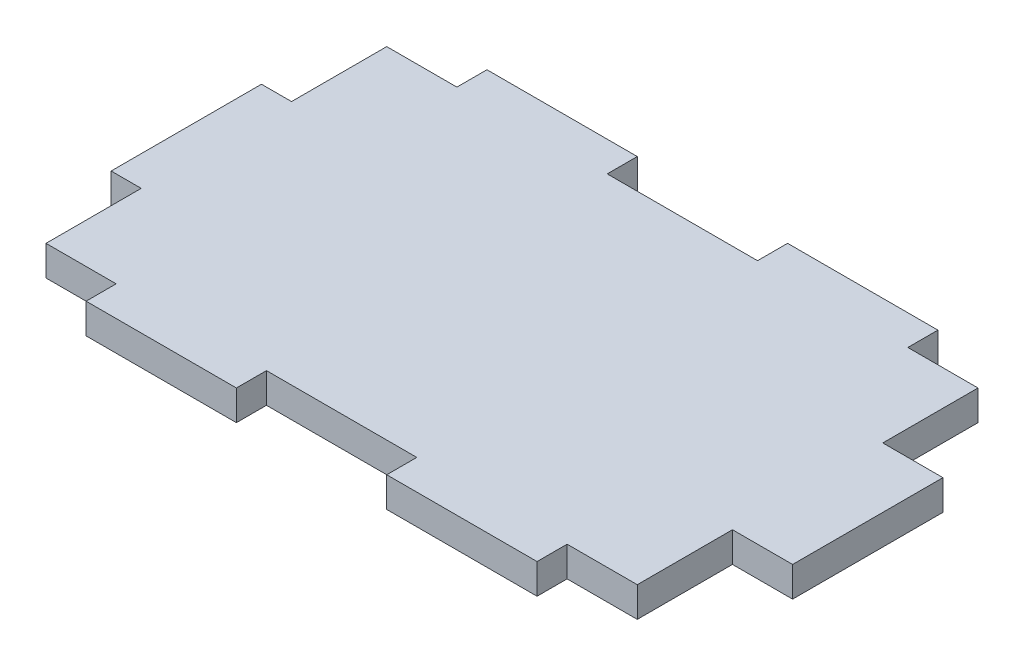
ISO-10303-21;
HEADER;
FILE_DESCRIPTION(('STEP AP214'),'2;1');
FILE_NAME('part.step','',(''),(''),'','','');
FILE_SCHEMA(('AUTOMOTIVE_DESIGN { 1 0 10303 214 1 1 1 1 }'));
ENDSEC;
DATA;
#1=APPLICATION_CONTEXT('core data for automotive mechanical design processes');
#2=APPLICATION_PROTOCOL_DEFINITION('international standard','automotive_design',2000,#1);
#3=PRODUCT_CONTEXT('',#1,'mechanical');
#4=PRODUCT('Part','Part','',(#3));
#5=PRODUCT_RELATED_PRODUCT_CATEGORY('part','',(#4));
#6=PRODUCT_DEFINITION_FORMATION('','',#4);
#7=PRODUCT_DEFINITION_CONTEXT('part definition',#1,'design');
#8=PRODUCT_DEFINITION('design','',#6,#7);
#9=PRODUCT_DEFINITION_SHAPE('','',#8);
#10=(LENGTH_UNIT() NAMED_UNIT(*) SI_UNIT(.MILLI.,.METRE.));
#11=(NAMED_UNIT(*) PLANE_ANGLE_UNIT() SI_UNIT($,.RADIAN.));
#12=(NAMED_UNIT(*) SI_UNIT($,.STERADIAN.) SOLID_ANGLE_UNIT());
#13=UNCERTAINTY_MEASURE_WITH_UNIT(LENGTH_MEASURE(1.E-05),#10,'distance_accuracy_value','');
#14=(GEOMETRIC_REPRESENTATION_CONTEXT(3) GLOBAL_UNCERTAINTY_ASSIGNED_CONTEXT((#13)) GLOBAL_UNIT_ASSIGNED_CONTEXT((#10,
#11,#12)) REPRESENTATION_CONTEXT('',''));
#15=CARTESIAN_POINT('',(0.,0.,0.));
#16=DIRECTION('',(0.,0.,1.));
#17=DIRECTION('',(1.,0.,0.));
#18=AXIS2_PLACEMENT_3D('',#15,#16,#17);
#19=CARTESIAN_POINT('',(55.,3.,0.));
#20=DIRECTION('',(-1.,0.,0.));
#21=DIRECTION('',(0.,0.,1.));
#22=AXIS2_PLACEMENT_3D('',#19,#20,#21);
#23=PLANE('',#22);
#24=DIRECTION('',(0.,0.,-1.));
#25=VECTOR('',#24,1.);
#26=CARTESIAN_POINT('',(55.,0.,0.));
#27=LINE('',#26,#25);
#28=CARTESIAN_POINT('',(55.,0.,0.));
#29=VERTEX_POINT('',#28);
#30=CARTESIAN_POINT('',(55.,0.,-3.));
#31=VERTEX_POINT('',#30);
#32=EDGE_CURVE('E251',#29,#31,#27,.T.);
#33=ORIENTED_EDGE('',*,*,#32,.T.);
#34=DIRECTION('',(0.,-1.,0.));
#35=VECTOR('',#34,1.);
#36=CARTESIAN_POINT('',(55.,3.,-3.));
#37=LINE('',#36,#35);
#38=CARTESIAN_POINT('',(55.,3.,-3.));
#39=VERTEX_POINT('',#38);
#40=EDGE_CURVE('E11',#39,#31,#37,.T.);
#41=ORIENTED_EDGE('',*,*,#40,.F.);
#42=DIRECTION('',(0.,0.,-1.));
#43=VECTOR('',#42,1.);
#44=CARTESIAN_POINT('',(55.,3.,0.));
#45=LINE('',#44,#43);
#46=CARTESIAN_POINT('',(55.,3.,0.));
#47=VERTEX_POINT('',#46);
#48=EDGE_CURVE('E325',#47,#39,#45,.T.);
#49=ORIENTED_EDGE('',*,*,#48,.F.);
#50=DIRECTION('',(0.,-1.,0.));
#51=VECTOR('',#50,1.);
#52=CARTESIAN_POINT('',(55.,3.,0.));
#53=LINE('',#52,#51);
#54=EDGE_CURVE('E250',#47,#29,#53,.T.);
#55=ORIENTED_EDGE('',*,*,#54,.T.);
#56=EDGE_LOOP('',(#33,#41,#49,#55));
#57=FACE_BOUND('',#56,.T.);
#58=ADVANCED_FACE('F34',(#57),#23,.F.);
#59=CARTESIAN_POINT('',(0.,3.,-3.));
#60=DIRECTION('',(0.,0.,-1.));
#61=DIRECTION('',(-1.,0.,0.));
#62=AXIS2_PLACEMENT_3D('',#59,#60,#61);
#63=PLANE('',#62);
#64=DIRECTION('',(1.,0.,0.));
#65=VECTOR('',#64,1.);
#66=CARTESIAN_POINT('',(0.,0.,-3.));
#67=LINE('',#66,#65);
#68=CARTESIAN_POINT('',(62.,0.,-3.));
#69=VERTEX_POINT('',#68);
#70=EDGE_CURVE('E254',#31,#69,#67,.T.);
#71=ORIENTED_EDGE('',*,*,#70,.T.);
#72=DIRECTION('',(0.,-1.,0.));
#73=VECTOR('',#72,1.);
#74=CARTESIAN_POINT('',(62.,3.,-3.));
#75=LINE('',#74,#73);
#76=CARTESIAN_POINT('',(62.,3.,-3.));
#77=VERTEX_POINT('',#76);
#78=EDGE_CURVE('E42',#77,#69,#75,.T.);
#79=ORIENTED_EDGE('',*,*,#78,.F.);
#80=DIRECTION('',(1.,0.,0.));
#81=VECTOR('',#80,1.);
#82=CARTESIAN_POINT('',(0.,3.,-3.));
#83=LINE('',#82,#81);
#84=EDGE_CURVE('E152',#39,#77,#83,.T.);
#85=ORIENTED_EDGE('',*,*,#84,.F.);
#86=ORIENTED_EDGE('',*,*,#40,.T.);
#87=EDGE_LOOP('',(#71,#79,#85,#86));
#88=FACE_BOUND('',#87,.T.);
#89=ADVANCED_FACE('F382',(#88),#63,.F.);
#90=CARTESIAN_POINT('',(62.,3.,0.));
#91=DIRECTION('',(1.,0.,0.));
#92=DIRECTION('',(0.,0.,-1.));
#93=AXIS2_PLACEMENT_3D('',#90,#91,#92);
#94=PLANE('',#93);
#95=DIRECTION('',(0.,0.,1.));
#96=VECTOR('',#95,1.);
#97=CARTESIAN_POINT('',(62.,0.,0.));
#98=LINE('',#97,#96);
#99=CARTESIAN_POINT('',(62.,0.,-12.5));
#100=VERTEX_POINT('',#99);
#101=EDGE_CURVE('E257',#100,#69,#98,.T.);
#102=ORIENTED_EDGE('',*,*,#101,.F.);
#103=DIRECTION('',(0.,-1.,0.));
#104=VECTOR('',#103,1.);
#105=CARTESIAN_POINT('',(62.,3.,-12.5));
#106=LINE('',#105,#104);
#107=CARTESIAN_POINT('',(62.,3.,-12.5));
#108=VERTEX_POINT('',#107);
#109=EDGE_CURVE('E375',#108,#100,#106,.T.);
#110=ORIENTED_EDGE('',*,*,#109,.F.);
#111=DIRECTION('',(0.,0.,1.));
#112=VECTOR('',#111,1.);
#113=CARTESIAN_POINT('',(62.,3.,0.));
#114=LINE('',#113,#112);
#115=EDGE_CURVE('E381',#108,#77,#114,.T.);
#116=ORIENTED_EDGE('',*,*,#115,.T.);
#117=ORIENTED_EDGE('',*,*,#78,.T.);
#118=EDGE_LOOP('',(#102,#110,#116,#117));
#119=FACE_BOUND('',#118,.T.);
#120=ADVANCED_FACE('F379',(#119),#94,.T.);
#121=CARTESIAN_POINT('',(0.,3.,-12.5));
#122=DIRECTION('',(0.,0.,1.));
#123=DIRECTION('',(1.,0.,0.));
#124=AXIS2_PLACEMENT_3D('',#121,#122,#123);
#125=PLANE('',#124);
#126=DIRECTION('',(-1.,0.,0.));
#127=VECTOR('',#126,1.);
#128=CARTESIAN_POINT('',(0.,0.,-12.5));
#129=LINE('',#128,#127);
#130=CARTESIAN_POINT('',(68.,0.,-12.5));
#131=VERTEX_POINT('',#130);
#132=EDGE_CURVE('E260',#131,#100,#129,.T.);
#133=ORIENTED_EDGE('',*,*,#132,.F.);
#134=DIRECTION('',(0.,-1.,0.));
#135=VECTOR('',#134,1.);
#136=CARTESIAN_POINT('',(68.,3.,-12.5));
#137=LINE('',#136,#135);
#138=CARTESIAN_POINT('',(68.,3.,-12.5));
#139=VERTEX_POINT('',#138);
#140=EDGE_CURVE('E373',#139,#131,#137,.T.);
#141=ORIENTED_EDGE('',*,*,#140,.F.);
#142=DIRECTION('',(-1.,0.,0.));
#143=VECTOR('',#142,1.);
#144=CARTESIAN_POINT('',(0.,3.,-12.5));
#145=LINE('',#144,#143);
#146=EDGE_CURVE('E394',#139,#108,#145,.T.);
#147=ORIENTED_EDGE('',*,*,#146,.T.);
#148=ORIENTED_EDGE('',*,*,#109,.T.);
#149=EDGE_LOOP('',(#133,#141,#147,#148));
#150=FACE_BOUND('',#149,.T.);
#151=ADVANCED_FACE('F391',(#150),#125,.T.);
#152=CARTESIAN_POINT('',(68.,3.,0.));
#153=DIRECTION('',(1.,0.,0.));
#154=DIRECTION('',(0.,0.,-1.));
#155=AXIS2_PLACEMENT_3D('',#152,#153,#154);
#156=PLANE('',#155);
#157=DIRECTION('',(0.,0.,1.));
#158=VECTOR('',#157,1.);
#159=CARTESIAN_POINT('',(68.,0.,0.));
#160=LINE('',#159,#158);
#161=CARTESIAN_POINT('',(68.,0.,-27.5));
#162=VERTEX_POINT('',#161);
#163=EDGE_CURVE('E263',#162,#131,#160,.T.);
#164=ORIENTED_EDGE('',*,*,#163,.F.);
#165=DIRECTION('',(0.,-1.,0.));
#166=VECTOR('',#165,1.);
#167=CARTESIAN_POINT('',(68.,3.,-27.5));
#168=LINE('',#167,#166);
#169=CARTESIAN_POINT('',(68.,3.,-27.5));
#170=VERTEX_POINT('',#169);
#171=EDGE_CURVE('E371',#170,#162,#168,.T.);
#172=ORIENTED_EDGE('',*,*,#171,.F.);
#173=DIRECTION('',(0.,0.,1.));
#174=VECTOR('',#173,1.);
#175=CARTESIAN_POINT('',(68.,3.,0.));
#176=LINE('',#175,#174);
#177=EDGE_CURVE('E398',#170,#139,#176,.T.);
#178=ORIENTED_EDGE('',*,*,#177,.T.);
#179=ORIENTED_EDGE('',*,*,#140,.T.);
#180=EDGE_LOOP('',(#164,#172,#178,#179));
#181=FACE_BOUND('',#180,.T.);
#182=ADVANCED_FACE('F482',(#181),#156,.T.);
#183=CARTESIAN_POINT('',(0.,3.,-27.5));
#184=DIRECTION('',(0.,0.,1.));
#185=DIRECTION('',(1.,0.,0.));
#186=AXIS2_PLACEMENT_3D('',#183,#184,#185);
#187=PLANE('',#186);
#188=DIRECTION('',(-1.,0.,0.));
#189=VECTOR('',#188,1.);
#190=CARTESIAN_POINT('',(0.,0.,-27.5));
#191=LINE('',#190,#189);
#192=CARTESIAN_POINT('',(62.,0.,-27.5));
#193=VERTEX_POINT('',#192);
#194=EDGE_CURVE('E266',#162,#193,#191,.T.);
#195=ORIENTED_EDGE('',*,*,#194,.T.);
#196=DIRECTION('',(0.,-1.,0.));
#197=VECTOR('',#196,1.);
#198=CARTESIAN_POINT('',(62.,3.,-27.5));
#199=LINE('',#198,#197);
#200=CARTESIAN_POINT('',(62.,3.,-27.5));
#201=VERTEX_POINT('',#200);
#202=EDGE_CURVE('E368',#201,#193,#199,.T.);
#203=ORIENTED_EDGE('',*,*,#202,.F.);
#204=DIRECTION('',(-1.,0.,0.));
#205=VECTOR('',#204,1.);
#206=CARTESIAN_POINT('',(0.,3.,-27.5));
#207=LINE('',#206,#205);
#208=EDGE_CURVE('E404',#170,#201,#207,.T.);
#209=ORIENTED_EDGE('',*,*,#208,.F.);
#210=ORIENTED_EDGE('',*,*,#171,.T.);
#211=EDGE_LOOP('',(#195,#203,#209,#210));
#212=FACE_BOUND('',#211,.T.);
#213=ADVANCED_FACE('F485',(#212),#187,.F.);
#214=CARTESIAN_POINT('',(62.,3.,0.));
#215=DIRECTION('',(-1.,0.,0.));
#216=DIRECTION('',(0.,0.,1.));
#217=AXIS2_PLACEMENT_3D('',#214,#215,#216);
#218=PLANE('',#217);
#219=DIRECTION('',(0.,0.,-1.));
#220=VECTOR('',#219,1.);
#221=CARTESIAN_POINT('',(62.,0.,0.));
#222=LINE('',#221,#220);
#223=CARTESIAN_POINT('',(62.,0.,-37.));
#224=VERTEX_POINT('',#223);
#225=EDGE_CURVE('E268',#193,#224,#222,.T.);
#226=ORIENTED_EDGE('',*,*,#225,.T.);
#227=DIRECTION('',(0.,-1.,0.));
#228=VECTOR('',#227,1.);
#229=CARTESIAN_POINT('',(62.,3.,-37.));
#230=LINE('',#229,#228);
#231=CARTESIAN_POINT('',(62.,3.,-37.));
#232=VERTEX_POINT('',#231);
#233=EDGE_CURVE('E366',#232,#224,#230,.T.);
#234=ORIENTED_EDGE('',*,*,#233,.F.);
#235=DIRECTION('',(0.,0.,-1.));
#236=VECTOR('',#235,1.);
#237=CARTESIAN_POINT('',(62.,3.,0.));
#238=LINE('',#237,#236);
#239=EDGE_CURVE('E406',#201,#232,#238,.T.);
#240=ORIENTED_EDGE('',*,*,#239,.F.);
#241=ORIENTED_EDGE('',*,*,#202,.T.);
#242=EDGE_LOOP('',(#226,#234,#240,#241));
#243=FACE_BOUND('',#242,.T.);
#244=ADVANCED_FACE('F489',(#243),#218,.F.);
#245=CARTESIAN_POINT('',(0.,3.,-37.));
#246=DIRECTION('',(0.,0.,-1.));
#247=DIRECTION('',(-1.,0.,0.));
#248=AXIS2_PLACEMENT_3D('',#245,#246,#247);
#249=PLANE('',#248);
#250=DIRECTION('',(1.,0.,0.));
#251=VECTOR('',#250,1.);
#252=CARTESIAN_POINT('',(0.,0.,-37.));
#253=LINE('',#252,#251);
#254=CARTESIAN_POINT('',(55.,0.,-37.));
#255=VERTEX_POINT('',#254);
#256=EDGE_CURVE('E271',#255,#224,#253,.T.);
#257=ORIENTED_EDGE('',*,*,#256,.F.);
#258=DIRECTION('',(0.,-1.,0.));
#259=VECTOR('',#258,1.);
#260=CARTESIAN_POINT('',(55.,3.,-37.));
#261=LINE('',#260,#259);
#262=CARTESIAN_POINT('',(55.,3.,-37.));
#263=VERTEX_POINT('',#262);
#264=EDGE_CURVE('E364',#263,#255,#261,.T.);
#265=ORIENTED_EDGE('',*,*,#264,.F.);
#266=DIRECTION('',(1.,0.,0.));
#267=VECTOR('',#266,1.);
#268=CARTESIAN_POINT('',(0.,3.,-37.));
#269=LINE('',#268,#267);
#270=EDGE_CURVE('E408',#263,#232,#269,.T.);
#271=ORIENTED_EDGE('',*,*,#270,.T.);
#272=ORIENTED_EDGE('',*,*,#233,.T.);
#273=EDGE_LOOP('',(#257,#265,#271,#272));
#274=FACE_BOUND('',#273,.T.);
#275=ADVANCED_FACE('F493',(#274),#249,.T.);
#276=CARTESIAN_POINT('',(55.,3.,0.));
#277=DIRECTION('',(1.,0.,0.));
#278=DIRECTION('',(0.,0.,-1.));
#279=AXIS2_PLACEMENT_3D('',#276,#277,#278);
#280=PLANE('',#279);
#281=DIRECTION('',(0.,0.,1.));
#282=VECTOR('',#281,1.);
#283=CARTESIAN_POINT('',(55.,0.,0.));
#284=LINE('',#283,#282);
#285=CARTESIAN_POINT('',(55.,0.,-40.));
#286=VERTEX_POINT('',#285);
#287=EDGE_CURVE('E274',#286,#255,#284,.T.);
#288=ORIENTED_EDGE('',*,*,#287,.F.);
#289=DIRECTION('',(0.,-1.,0.));
#290=VECTOR('',#289,1.);
#291=CARTESIAN_POINT('',(55.,3.,-40.));
#292=LINE('',#291,#290);
#293=CARTESIAN_POINT('',(55.,3.,-40.));
#294=VERTEX_POINT('',#293);
#295=EDGE_CURVE('E362',#294,#286,#292,.T.);
#296=ORIENTED_EDGE('',*,*,#295,.F.);
#297=DIRECTION('',(0.,0.,1.));
#298=VECTOR('',#297,1.);
#299=CARTESIAN_POINT('',(55.,3.,0.));
#300=LINE('',#299,#298);
#301=EDGE_CURVE('E411',#294,#263,#300,.T.);
#302=ORIENTED_EDGE('',*,*,#301,.T.);
#303=ORIENTED_EDGE('',*,*,#264,.T.);
#304=EDGE_LOOP('',(#288,#296,#302,#303));
#305=FACE_BOUND('',#304,.T.);
#306=ADVANCED_FACE('F497',(#305),#280,.T.);
#307=CARTESIAN_POINT('',(0.,3.,-40.));
#308=DIRECTION('',(0.,0.,-1.));
#309=DIRECTION('',(-1.,0.,0.));
#310=AXIS2_PLACEMENT_3D('',#307,#308,#309);
#311=PLANE('',#310);
#312=DIRECTION('',(1.,0.,0.));
#313=VECTOR('',#312,1.);
#314=CARTESIAN_POINT('',(0.,0.,-40.));
#315=LINE('',#314,#313);
#316=CARTESIAN_POINT('',(40.,0.,-40.));
#317=VERTEX_POINT('',#316);
#318=EDGE_CURVE('E277',#317,#286,#315,.T.);
#319=ORIENTED_EDGE('',*,*,#318,.F.);
#320=DIRECTION('',(0.,-1.,0.));
#321=VECTOR('',#320,1.);
#322=CARTESIAN_POINT('',(40.,3.,-40.));
#323=LINE('',#322,#321);
#324=CARTESIAN_POINT('',(40.,3.,-40.));
#325=VERTEX_POINT('',#324);
#326=EDGE_CURVE('E360',#325,#317,#323,.T.);
#327=ORIENTED_EDGE('',*,*,#326,.F.);
#328=DIRECTION('',(1.,0.,0.));
#329=VECTOR('',#328,1.);
#330=CARTESIAN_POINT('',(0.,3.,-40.));
#331=LINE('',#330,#329);
#332=EDGE_CURVE('E414',#325,#294,#331,.T.);
#333=ORIENTED_EDGE('',*,*,#332,.T.);
#334=ORIENTED_EDGE('',*,*,#295,.T.);
#335=EDGE_LOOP('',(#319,#327,#333,#334));
#336=FACE_BOUND('',#335,.T.);
#337=ADVANCED_FACE('F501',(#336),#311,.T.);
#338=CARTESIAN_POINT('',(40.,3.,0.));
#339=DIRECTION('',(-1.,0.,0.));
#340=DIRECTION('',(0.,0.,1.));
#341=AXIS2_PLACEMENT_3D('',#338,#339,#340);
#342=PLANE('',#341);
#343=DIRECTION('',(0.,0.,-1.));
#344=VECTOR('',#343,1.);
#345=CARTESIAN_POINT('',(40.,0.,0.));
#346=LINE('',#345,#344);
#347=CARTESIAN_POINT('',(40.,0.,-37.));
#348=VERTEX_POINT('',#347);
#349=EDGE_CURVE('E280',#348,#317,#346,.T.);
#350=ORIENTED_EDGE('',*,*,#349,.F.);
#351=DIRECTION('',(0.,-1.,0.));
#352=VECTOR('',#351,1.);
#353=CARTESIAN_POINT('',(40.,3.,-37.));
#354=LINE('',#353,#352);
#355=CARTESIAN_POINT('',(40.,3.,-37.));
#356=VERTEX_POINT('',#355);
#357=EDGE_CURVE('E358',#356,#348,#354,.T.);
#358=ORIENTED_EDGE('',*,*,#357,.F.);
#359=DIRECTION('',(0.,0.,-1.));
#360=VECTOR('',#359,1.);
#361=CARTESIAN_POINT('',(40.,3.,0.));
#362=LINE('',#361,#360);
#363=EDGE_CURVE('E417',#356,#325,#362,.T.);
#364=ORIENTED_EDGE('',*,*,#363,.T.);
#365=ORIENTED_EDGE('',*,*,#326,.T.);
#366=EDGE_LOOP('',(#350,#358,#364,#365));
#367=FACE_BOUND('',#366,.T.);
#368=ADVANCED_FACE('F505',(#367),#342,.T.);
#369=CARTESIAN_POINT('',(0.,3.,-37.));
#370=DIRECTION('',(0.,0.,1.));
#371=DIRECTION('',(1.,0.,0.));
#372=AXIS2_PLACEMENT_3D('',#369,#370,#371);
#373=PLANE('',#372);
#374=DIRECTION('',(-1.,0.,0.));
#375=VECTOR('',#374,1.);
#376=CARTESIAN_POINT('',(0.,0.,-37.));
#377=LINE('',#376,#375);
#378=CARTESIAN_POINT('',(25.,0.,-37.));
#379=VERTEX_POINT('',#378);
#380=EDGE_CURVE('E283',#348,#379,#377,.T.);
#381=ORIENTED_EDGE('',*,*,#380,.T.);
#382=DIRECTION('',(0.,-1.,0.));
#383=VECTOR('',#382,1.);
#384=CARTESIAN_POINT('',(25.,3.,-37.));
#385=LINE('',#384,#383);
#386=CARTESIAN_POINT('',(25.,3.,-37.));
#387=VERTEX_POINT('',#386);
#388=EDGE_CURVE('E355',#387,#379,#385,.T.);
#389=ORIENTED_EDGE('',*,*,#388,.F.);
#390=DIRECTION('',(-1.,0.,0.));
#391=VECTOR('',#390,1.);
#392=CARTESIAN_POINT('',(0.,3.,-37.));
#393=LINE('',#392,#391);
#394=EDGE_CURVE('E420',#356,#387,#393,.T.);
#395=ORIENTED_EDGE('',*,*,#394,.F.);
#396=ORIENTED_EDGE('',*,*,#357,.T.);
#397=EDGE_LOOP('',(#381,#389,#395,#396));
#398=FACE_BOUND('',#397,.T.);
#399=ADVANCED_FACE('F509',(#398),#373,.F.);
#400=CARTESIAN_POINT('',(25.,3.,0.));
#401=DIRECTION('',(-1.,0.,0.));
#402=DIRECTION('',(0.,0.,1.));
#403=AXIS2_PLACEMENT_3D('',#400,#401,#402);
#404=PLANE('',#403);
#405=DIRECTION('',(0.,0.,-1.));
#406=VECTOR('',#405,1.);
#407=CARTESIAN_POINT('',(25.,0.,0.));
#408=LINE('',#407,#406);
#409=CARTESIAN_POINT('',(25.,0.,-40.));
#410=VERTEX_POINT('',#409);
#411=EDGE_CURVE('E285',#379,#410,#408,.T.);
#412=ORIENTED_EDGE('',*,*,#411,.T.);
#413=DIRECTION('',(0.,-1.,0.));
#414=VECTOR('',#413,1.);
#415=CARTESIAN_POINT('',(25.,3.,-40.));
#416=LINE('',#415,#414);
#417=CARTESIAN_POINT('',(25.,3.,-40.));
#418=VERTEX_POINT('',#417);
#419=EDGE_CURVE('E353',#418,#410,#416,.T.);
#420=ORIENTED_EDGE('',*,*,#419,.F.);
#421=DIRECTION('',(0.,0.,-1.));
#422=VECTOR('',#421,1.);
#423=CARTESIAN_POINT('',(25.,3.,0.));
#424=LINE('',#423,#422);
#425=EDGE_CURVE('E422',#387,#418,#424,.T.);
#426=ORIENTED_EDGE('',*,*,#425,.F.);
#427=ORIENTED_EDGE('',*,*,#388,.T.);
#428=EDGE_LOOP('',(#412,#420,#426,#427));
#429=FACE_BOUND('',#428,.T.);
#430=ADVANCED_FACE('F513',(#429),#404,.F.);
#431=CARTESIAN_POINT('',(0.,3.,-40.));
#432=DIRECTION('',(0.,0.,-1.));
#433=DIRECTION('',(-1.,0.,0.));
#434=AXIS2_PLACEMENT_3D('',#431,#432,#433);
#435=PLANE('',#434);
#436=DIRECTION('',(1.,0.,0.));
#437=VECTOR('',#436,1.);
#438=CARTESIAN_POINT('',(0.,0.,-40.));
#439=LINE('',#438,#437);
#440=CARTESIAN_POINT('',(10.,0.,-40.));
#441=VERTEX_POINT('',#440);
#442=EDGE_CURVE('E288',#441,#410,#439,.T.);
#443=ORIENTED_EDGE('',*,*,#442,.F.);
#444=DIRECTION('',(0.,-1.,0.));
#445=VECTOR('',#444,1.);
#446=CARTESIAN_POINT('',(10.,3.,-40.));
#447=LINE('',#446,#445);
#448=CARTESIAN_POINT('',(10.,3.,-40.));
#449=VERTEX_POINT('',#448);
#450=EDGE_CURVE('E351',#449,#441,#447,.T.);
#451=ORIENTED_EDGE('',*,*,#450,.F.);
#452=DIRECTION('',(1.,0.,0.));
#453=VECTOR('',#452,1.);
#454=CARTESIAN_POINT('',(0.,3.,-40.));
#455=LINE('',#454,#453);
#456=EDGE_CURVE('E424',#449,#418,#455,.T.);
#457=ORIENTED_EDGE('',*,*,#456,.T.);
#458=ORIENTED_EDGE('',*,*,#419,.T.);
#459=EDGE_LOOP('',(#443,#451,#457,#458));
#460=FACE_BOUND('',#459,.T.);
#461=ADVANCED_FACE('F517',(#460),#435,.T.);
#462=CARTESIAN_POINT('',(10.,3.,0.));
#463=DIRECTION('',(1.,0.,0.));
#464=DIRECTION('',(0.,0.,-1.));
#465=AXIS2_PLACEMENT_3D('',#462,#463,#464);
#466=PLANE('',#465);
#467=DIRECTION('',(0.,0.,1.));
#468=VECTOR('',#467,1.);
#469=CARTESIAN_POINT('',(10.,0.,0.));
#470=LINE('',#469,#468);
#471=CARTESIAN_POINT('',(10.,0.,-37.));
#472=VERTEX_POINT('',#471);
#473=EDGE_CURVE('E291',#441,#472,#470,.T.);
#474=ORIENTED_EDGE('',*,*,#473,.T.);
#475=DIRECTION('',(0.,-1.,0.));
#476=VECTOR('',#475,1.);
#477=CARTESIAN_POINT('',(10.,3.,-37.));
#478=LINE('',#477,#476);
#479=CARTESIAN_POINT('',(10.,3.,-37.));
#480=VERTEX_POINT('',#479);
#481=EDGE_CURVE('E348',#480,#472,#478,.T.);
#482=ORIENTED_EDGE('',*,*,#481,.F.);
#483=DIRECTION('',(0.,0.,1.));
#484=VECTOR('',#483,1.);
#485=CARTESIAN_POINT('',(10.,3.,0.));
#486=LINE('',#485,#484);
#487=EDGE_CURVE('E427',#449,#480,#486,.T.);
#488=ORIENTED_EDGE('',*,*,#487,.F.);
#489=ORIENTED_EDGE('',*,*,#450,.T.);
#490=EDGE_LOOP('',(#474,#482,#488,#489));
#491=FACE_BOUND('',#490,.T.);
#492=ADVANCED_FACE('F521',(#491),#466,.F.);
#493=CARTESIAN_POINT('',(0.,3.,-37.));
#494=DIRECTION('',(0.,0.,1.));
#495=DIRECTION('',(1.,0.,0.));
#496=AXIS2_PLACEMENT_3D('',#493,#494,#495);
#497=PLANE('',#496);
#498=DIRECTION('',(-1.,0.,0.));
#499=VECTOR('',#498,1.);
#500=CARTESIAN_POINT('',(0.,0.,-37.));
#501=LINE('',#500,#499);
#502=CARTESIAN_POINT('',(3.,0.,-37.));
#503=VERTEX_POINT('',#502);
#504=EDGE_CURVE('E293',#472,#503,#501,.T.);
#505=ORIENTED_EDGE('',*,*,#504,.T.);
#506=DIRECTION('',(0.,-1.,0.));
#507=VECTOR('',#506,1.);
#508=CARTESIAN_POINT('',(3.,3.,-37.));
#509=LINE('',#508,#507);
#510=CARTESIAN_POINT('',(3.,3.,-37.));
#511=VERTEX_POINT('',#510);
#512=EDGE_CURVE('E346',#511,#503,#509,.T.);
#513=ORIENTED_EDGE('',*,*,#512,.F.);
#514=DIRECTION('',(-1.,0.,0.));
#515=VECTOR('',#514,1.);
#516=CARTESIAN_POINT('',(0.,3.,-37.));
#517=LINE('',#516,#515);
#518=EDGE_CURVE('E429',#480,#511,#517,.T.);
#519=ORIENTED_EDGE('',*,*,#518,.F.);
#520=ORIENTED_EDGE('',*,*,#481,.T.);
#521=EDGE_LOOP('',(#505,#513,#519,#520));
#522=FACE_BOUND('',#521,.T.);
#523=ADVANCED_FACE('F525',(#522),#497,.F.);
#524=CARTESIAN_POINT('',(3.,3.,0.));
#525=DIRECTION('',(-1.,0.,0.));
#526=DIRECTION('',(0.,0.,1.));
#527=AXIS2_PLACEMENT_3D('',#524,#525,#526);
#528=PLANE('',#527);
#529=DIRECTION('',(0.,0.,-1.));
#530=VECTOR('',#529,1.);
#531=CARTESIAN_POINT('',(3.,0.,0.));
#532=LINE('',#531,#530);
#533=CARTESIAN_POINT('',(3.,0.,-27.5));
#534=VERTEX_POINT('',#533);
#535=EDGE_CURVE('E296',#534,#503,#532,.T.);
#536=ORIENTED_EDGE('',*,*,#535,.F.);
#537=DIRECTION('',(0.,-1.,0.));
#538=VECTOR('',#537,1.);
#539=CARTESIAN_POINT('',(3.,3.,-27.5));
#540=LINE('',#539,#538);
#541=CARTESIAN_POINT('',(3.,3.,-27.5));
#542=VERTEX_POINT('',#541);
#543=EDGE_CURVE('E344',#542,#534,#540,.T.);
#544=ORIENTED_EDGE('',*,*,#543,.F.);
#545=DIRECTION('',(0.,0.,-1.));
#546=VECTOR('',#545,1.);
#547=CARTESIAN_POINT('',(3.,3.,0.));
#548=LINE('',#547,#546);
#549=EDGE_CURVE('E431',#542,#511,#548,.T.);
#550=ORIENTED_EDGE('',*,*,#549,.T.);
#551=ORIENTED_EDGE('',*,*,#512,.T.);
#552=EDGE_LOOP('',(#536,#544,#550,#551));
#553=FACE_BOUND('',#552,.T.);
#554=ADVANCED_FACE('F529',(#553),#528,.T.);
#555=CARTESIAN_POINT('',(0.,3.,-27.5));
#556=DIRECTION('',(0.,0.,-1.));
#557=DIRECTION('',(-1.,0.,0.));
#558=AXIS2_PLACEMENT_3D('',#555,#556,#557);
#559=PLANE('',#558);
#560=DIRECTION('',(1.,0.,0.));
#561=VECTOR('',#560,1.);
#562=CARTESIAN_POINT('',(0.,0.,-27.5));
#563=LINE('',#562,#561);
#564=CARTESIAN_POINT('',(0.,0.,-27.5));
#565=VERTEX_POINT('',#564);
#566=EDGE_CURVE('E299',#565,#534,#563,.T.);
#567=ORIENTED_EDGE('',*,*,#566,.F.);
#568=DIRECTION('',(0.,-1.,0.));
#569=VECTOR('',#568,1.);
#570=CARTESIAN_POINT('',(0.,3.,-27.5));
#571=LINE('',#570,#569);
#572=CARTESIAN_POINT('',(0.,3.,-27.5));
#573=VERTEX_POINT('',#572);
#574=EDGE_CURVE('E342',#573,#565,#571,.T.);
#575=ORIENTED_EDGE('',*,*,#574,.F.);
#576=DIRECTION('',(1.,0.,0.));
#577=VECTOR('',#576,1.);
#578=CARTESIAN_POINT('',(0.,3.,-27.5));
#579=LINE('',#578,#577);
#580=EDGE_CURVE('E434',#573,#542,#579,.T.);
#581=ORIENTED_EDGE('',*,*,#580,.T.);
#582=ORIENTED_EDGE('',*,*,#543,.T.);
#583=EDGE_LOOP('',(#567,#575,#581,#582));
#584=FACE_BOUND('',#583,.T.);
#585=ADVANCED_FACE('F533',(#584),#559,.T.);
#586=CARTESIAN_POINT('',(0.,3.,0.));
#587=DIRECTION('',(-1.,0.,0.));
#588=DIRECTION('',(0.,0.,1.));
#589=AXIS2_PLACEMENT_3D('',#586,#587,#588);
#590=PLANE('',#589);
#591=DIRECTION('',(0.,0.,-1.));
#592=VECTOR('',#591,1.);
#593=CARTESIAN_POINT('',(0.,0.,0.));
#594=LINE('',#593,#592);
#595=CARTESIAN_POINT('',(0.,0.,-12.5));
#596=VERTEX_POINT('',#595);
#597=EDGE_CURVE('E302',#596,#565,#594,.T.);
#598=ORIENTED_EDGE('',*,*,#597,.F.);
#599=DIRECTION('',(0.,-1.,0.));
#600=VECTOR('',#599,1.);
#601=CARTESIAN_POINT('',(0.,3.,-12.5));
#602=LINE('',#601,#600);
#603=CARTESIAN_POINT('',(0.,3.,-12.5));
#604=VERTEX_POINT('',#603);
#605=EDGE_CURVE('E340',#604,#596,#602,.T.);
#606=ORIENTED_EDGE('',*,*,#605,.F.);
#607=DIRECTION('',(0.,0.,-1.));
#608=VECTOR('',#607,1.);
#609=CARTESIAN_POINT('',(0.,3.,0.));
#610=LINE('',#609,#608);
#611=EDGE_CURVE('E437',#604,#573,#610,.T.);
#612=ORIENTED_EDGE('',*,*,#611,.T.);
#613=ORIENTED_EDGE('',*,*,#574,.T.);
#614=EDGE_LOOP('',(#598,#606,#612,#613));
#615=FACE_BOUND('',#614,.T.);
#616=ADVANCED_FACE('F537',(#615),#590,.T.);
#617=CARTESIAN_POINT('',(0.,3.,-12.5));
#618=DIRECTION('',(0.,0.,-1.));
#619=DIRECTION('',(-1.,0.,0.));
#620=AXIS2_PLACEMENT_3D('',#617,#618,#619);
#621=PLANE('',#620);
#622=DIRECTION('',(1.,0.,0.));
#623=VECTOR('',#622,1.);
#624=CARTESIAN_POINT('',(0.,0.,-12.5));
#625=LINE('',#624,#623);
#626=CARTESIAN_POINT('',(3.,0.,-12.5));
#627=VERTEX_POINT('',#626);
#628=EDGE_CURVE('E305',#596,#627,#625,.T.);
#629=ORIENTED_EDGE('',*,*,#628,.T.);
#630=DIRECTION('',(0.,-1.,0.));
#631=VECTOR('',#630,1.);
#632=CARTESIAN_POINT('',(3.,3.,-12.5));
#633=LINE('',#632,#631);
#634=CARTESIAN_POINT('',(3.,3.,-12.5));
#635=VERTEX_POINT('',#634);
#636=EDGE_CURVE('E337',#635,#627,#633,.T.);
#637=ORIENTED_EDGE('',*,*,#636,.F.);
#638=DIRECTION('',(1.,0.,0.));
#639=VECTOR('',#638,1.);
#640=CARTESIAN_POINT('',(0.,3.,-12.5));
#641=LINE('',#640,#639);
#642=EDGE_CURVE('E440',#604,#635,#641,.T.);
#643=ORIENTED_EDGE('',*,*,#642,.F.);
#644=ORIENTED_EDGE('',*,*,#605,.T.);
#645=EDGE_LOOP('',(#629,#637,#643,#644));
#646=FACE_BOUND('',#645,.T.);
#647=ADVANCED_FACE('F541',(#646),#621,.F.);
#648=CARTESIAN_POINT('',(3.,3.,0.));
#649=DIRECTION('',(1.,0.,0.));
#650=DIRECTION('',(0.,0.,-1.));
#651=AXIS2_PLACEMENT_3D('',#648,#649,#650);
#652=PLANE('',#651);
#653=DIRECTION('',(0.,0.,1.));
#654=VECTOR('',#653,1.);
#655=CARTESIAN_POINT('',(3.,0.,0.));
#656=LINE('',#655,#654);
#657=CARTESIAN_POINT('',(3.,0.,-3.));
#658=VERTEX_POINT('',#657);
#659=EDGE_CURVE('E307',#627,#658,#656,.T.);
#660=ORIENTED_EDGE('',*,*,#659,.T.);
#661=DIRECTION('',(0.,-1.,0.));
#662=VECTOR('',#661,1.);
#663=CARTESIAN_POINT('',(3.,3.,-3.));
#664=LINE('',#663,#662);
#665=CARTESIAN_POINT('',(3.,3.,-3.));
#666=VERTEX_POINT('',#665);
#667=EDGE_CURVE('E335',#666,#658,#664,.T.);
#668=ORIENTED_EDGE('',*,*,#667,.F.);
#669=DIRECTION('',(0.,0.,1.));
#670=VECTOR('',#669,1.);
#671=CARTESIAN_POINT('',(3.,3.,0.));
#672=LINE('',#671,#670);
#673=EDGE_CURVE('E442',#635,#666,#672,.T.);
#674=ORIENTED_EDGE('',*,*,#673,.F.);
#675=ORIENTED_EDGE('',*,*,#636,.T.);
#676=EDGE_LOOP('',(#660,#668,#674,#675));
#677=FACE_BOUND('',#676,.T.);
#678=ADVANCED_FACE('F545',(#677),#652,.F.);
#679=CARTESIAN_POINT('',(0.,3.,-3.));
#680=DIRECTION('',(0.,0.,1.));
#681=DIRECTION('',(1.,0.,0.));
#682=AXIS2_PLACEMENT_3D('',#679,#680,#681);
#683=PLANE('',#682);
#684=DIRECTION('',(-1.,0.,0.));
#685=VECTOR('',#684,1.);
#686=CARTESIAN_POINT('',(0.,0.,-3.));
#687=LINE('',#686,#685);
#688=CARTESIAN_POINT('',(10.,0.,-3.));
#689=VERTEX_POINT('',#688);
#690=EDGE_CURVE('E310',#689,#658,#687,.T.);
#691=ORIENTED_EDGE('',*,*,#690,.F.);
#692=DIRECTION('',(0.,-1.,0.));
#693=VECTOR('',#692,1.);
#694=CARTESIAN_POINT('',(10.,3.,-3.));
#695=LINE('',#694,#693);
#696=CARTESIAN_POINT('',(10.,3.,-3.));
#697=VERTEX_POINT('',#696);
#698=EDGE_CURVE('E333',#697,#689,#695,.T.);
#699=ORIENTED_EDGE('',*,*,#698,.F.);
#700=DIRECTION('',(-1.,0.,0.));
#701=VECTOR('',#700,1.);
#702=CARTESIAN_POINT('',(0.,3.,-3.));
#703=LINE('',#702,#701);
#704=EDGE_CURVE('E444',#697,#666,#703,.T.);
#705=ORIENTED_EDGE('',*,*,#704,.T.);
#706=ORIENTED_EDGE('',*,*,#667,.T.);
#707=EDGE_LOOP('',(#691,#699,#705,#706));
#708=FACE_BOUND('',#707,.T.);
#709=ADVANCED_FACE('F549',(#708),#683,.T.);
#710=CARTESIAN_POINT('',(10.,3.,0.));
#711=DIRECTION('',(-1.,0.,0.));
#712=DIRECTION('',(0.,0.,1.));
#713=AXIS2_PLACEMENT_3D('',#710,#711,#712);
#714=PLANE('',#713);
#715=DIRECTION('',(0.,0.,-1.));
#716=VECTOR('',#715,1.);
#717=CARTESIAN_POINT('',(10.,0.,0.));
#718=LINE('',#717,#716);
#719=CARTESIAN_POINT('',(10.,0.,0.));
#720=VERTEX_POINT('',#719);
#721=EDGE_CURVE('E313',#720,#689,#718,.T.);
#722=ORIENTED_EDGE('',*,*,#721,.F.);
#723=DIRECTION('',(0.,-1.,0.));
#724=VECTOR('',#723,1.);
#725=CARTESIAN_POINT('',(10.,3.,0.));
#726=LINE('',#725,#724);
#727=CARTESIAN_POINT('',(10.,3.,0.));
#728=VERTEX_POINT('',#727);
#729=EDGE_CURVE('E331',#728,#720,#726,.T.);
#730=ORIENTED_EDGE('',*,*,#729,.F.);
#731=DIRECTION('',(0.,0.,-1.));
#732=VECTOR('',#731,1.);
#733=CARTESIAN_POINT('',(10.,3.,0.));
#734=LINE('',#733,#732);
#735=EDGE_CURVE('E447',#728,#697,#734,.T.);
#736=ORIENTED_EDGE('',*,*,#735,.T.);
#737=ORIENTED_EDGE('',*,*,#698,.T.);
#738=EDGE_LOOP('',(#722,#730,#736,#737));
#739=FACE_BOUND('',#738,.T.);
#740=ADVANCED_FACE('F553',(#739),#714,.T.);
#741=CARTESIAN_POINT('',(0.,3.,0.));
#742=DIRECTION('',(0.,0.,-1.));
#743=DIRECTION('',(-1.,0.,0.));
#744=AXIS2_PLACEMENT_3D('',#741,#742,#743);
#745=PLANE('',#744);
#746=DIRECTION('',(1.,0.,0.));
#747=VECTOR('',#746,1.);
#748=CARTESIAN_POINT('',(0.,0.,0.));
#749=LINE('',#748,#747);
#750=CARTESIAN_POINT('',(25.,0.,0.));
#751=VERTEX_POINT('',#750);
#752=EDGE_CURVE('E316',#720,#751,#749,.T.);
#753=ORIENTED_EDGE('',*,*,#752,.T.);
#754=DIRECTION('',(0.,-1.,0.));
#755=VECTOR('',#754,1.);
#756=CARTESIAN_POINT('',(25.,3.,0.));
#757=LINE('',#756,#755);
#758=CARTESIAN_POINT('',(25.,3.,0.));
#759=VERTEX_POINT('',#758);
#760=EDGE_CURVE('E329',#759,#751,#757,.T.);
#761=ORIENTED_EDGE('',*,*,#760,.F.);
#762=DIRECTION('',(1.,0.,0.));
#763=VECTOR('',#762,1.);
#764=CARTESIAN_POINT('',(0.,3.,0.));
#765=LINE('',#764,#763);
#766=EDGE_CURVE('E245',#728,#759,#765,.T.);
#767=ORIENTED_EDGE('',*,*,#766,.F.);
#768=ORIENTED_EDGE('',*,*,#729,.T.);
#769=EDGE_LOOP('',(#753,#761,#767,#768));
#770=FACE_BOUND('',#769,.T.);
#771=ADVANCED_FACE('F454',(#770),#745,.F.);
#772=CARTESIAN_POINT('',(25.,3.,0.));
#773=DIRECTION('',(1.,0.,0.));
#774=DIRECTION('',(0.,0.,-1.));
#775=AXIS2_PLACEMENT_3D('',#772,#773,#774);
#776=PLANE('',#775);
#777=DIRECTION('',(0.,0.,1.));
#778=VECTOR('',#777,1.);
#779=CARTESIAN_POINT('',(25.,0.,0.));
#780=LINE('',#779,#778);
#781=CARTESIAN_POINT('',(25.,0.,-3.));
#782=VERTEX_POINT('',#781);
#783=EDGE_CURVE('E319',#782,#751,#780,.T.);
#784=ORIENTED_EDGE('',*,*,#783,.F.);
#785=DIRECTION('',(0.,-1.,0.));
#786=VECTOR('',#785,1.);
#787=CARTESIAN_POINT('',(25.,3.,-3.));
#788=LINE('',#787,#786);
#789=CARTESIAN_POINT('',(25.,3.,-3.));
#790=VERTEX_POINT('',#789);
#791=EDGE_CURVE('E234',#790,#782,#788,.T.);
#792=ORIENTED_EDGE('',*,*,#791,.F.);
#793=DIRECTION('',(0.,0.,1.));
#794=VECTOR('',#793,1.);
#795=CARTESIAN_POINT('',(25.,3.,0.));
#796=LINE('',#795,#794);
#797=EDGE_CURVE('E243',#790,#759,#796,.T.);
#798=ORIENTED_EDGE('',*,*,#797,.T.);
#799=ORIENTED_EDGE('',*,*,#760,.T.);
#800=EDGE_LOOP('',(#784,#792,#798,#799));
#801=FACE_BOUND('',#800,.T.);
#802=ADVANCED_FACE('F458',(#801),#776,.T.);
#803=CARTESIAN_POINT('',(0.,3.,-3.));
#804=DIRECTION('',(0.,0.,1.));
#805=DIRECTION('',(1.,0.,0.));
#806=AXIS2_PLACEMENT_3D('',#803,#804,#805);
#807=PLANE('',#806);
#808=DIRECTION('',(-1.,0.,0.));
#809=VECTOR('',#808,1.);
#810=CARTESIAN_POINT('',(0.,0.,-3.));
#811=LINE('',#810,#809);
#812=CARTESIAN_POINT('',(40.,0.,-3.));
#813=VERTEX_POINT('',#812);
#814=EDGE_CURVE('E233',#813,#782,#811,.T.);
#815=ORIENTED_EDGE('',*,*,#814,.F.);
#816=DIRECTION('',(0.,-1.,0.));
#817=VECTOR('',#816,1.);
#818=CARTESIAN_POINT('',(40.,3.,-3.));
#819=LINE('',#818,#817);
#820=CARTESIAN_POINT('',(40.,3.,-3.));
#821=VERTEX_POINT('',#820);
#822=EDGE_CURVE('E227',#821,#813,#819,.T.);
#823=ORIENTED_EDGE('',*,*,#822,.F.);
#824=DIRECTION('',(-1.,0.,0.));
#825=VECTOR('',#824,1.);
#826=CARTESIAN_POINT('',(0.,3.,-3.));
#827=LINE('',#826,#825);
#828=EDGE_CURVE('E231',#821,#790,#827,.T.);
#829=ORIENTED_EDGE('',*,*,#828,.T.);
#830=ORIENTED_EDGE('',*,*,#791,.T.);
#831=EDGE_LOOP('',(#815,#823,#829,#830));
#832=FACE_BOUND('',#831,.T.);
#833=ADVANCED_FACE('F229',(#832),#807,.T.);
#834=CARTESIAN_POINT('',(40.,3.,0.));
#835=DIRECTION('',(1.,0.,0.));
#836=DIRECTION('',(0.,0.,-1.));
#837=AXIS2_PLACEMENT_3D('',#834,#835,#836);
#838=PLANE('',#837);
#839=DIRECTION('',(0.,0.,1.));
#840=VECTOR('',#839,1.);
#841=CARTESIAN_POINT('',(40.,0.,0.));
#842=LINE('',#841,#840);
#843=CARTESIAN_POINT('',(40.,0.,0.));
#844=VERTEX_POINT('',#843);
#845=EDGE_CURVE('E138',#813,#844,#842,.T.);
#846=ORIENTED_EDGE('',*,*,#845,.T.);
#847=DIRECTION('',(0.,-1.,0.));
#848=VECTOR('',#847,1.);
#849=CARTESIAN_POINT('',(40.,3.,0.));
#850=LINE('',#849,#848);
#851=CARTESIAN_POINT('',(40.,3.,0.));
#852=VERTEX_POINT('',#851);
#853=EDGE_CURVE('E235',#852,#844,#850,.T.);
#854=ORIENTED_EDGE('',*,*,#853,.F.);
#855=DIRECTION('',(0.,0.,1.));
#856=VECTOR('',#855,1.);
#857=CARTESIAN_POINT('',(40.,3.,0.));
#858=LINE('',#857,#856);
#859=EDGE_CURVE('E237',#821,#852,#858,.T.);
#860=ORIENTED_EDGE('',*,*,#859,.F.);
#861=ORIENTED_EDGE('',*,*,#822,.T.);
#862=EDGE_LOOP('',(#846,#854,#860,#861));
#863=FACE_BOUND('',#862,.T.);
#864=ADVANCED_FACE('F238',(#863),#838,.F.);
#865=CARTESIAN_POINT('',(0.,3.,0.));
#866=DIRECTION('',(0.,0.,-1.));
#867=DIRECTION('',(-1.,0.,0.));
#868=AXIS2_PLACEMENT_3D('',#865,#866,#867);
#869=PLANE('',#868);
#870=DIRECTION('',(1.,0.,0.));
#871=VECTOR('',#870,1.);
#872=CARTESIAN_POINT('',(0.,0.,0.));
#873=LINE('',#872,#871);
#874=EDGE_CURVE('E144',#844,#29,#873,.T.);
#875=ORIENTED_EDGE('',*,*,#874,.T.);
#876=ORIENTED_EDGE('',*,*,#54,.F.);
#877=DIRECTION('',(1.,0.,0.));
#878=VECTOR('',#877,1.);
#879=CARTESIAN_POINT('',(0.,3.,0.));
#880=LINE('',#879,#878);
#881=EDGE_CURVE('E50',#852,#47,#880,.T.);
#882=ORIENTED_EDGE('',*,*,#881,.F.);
#883=ORIENTED_EDGE('',*,*,#853,.T.);
#884=EDGE_LOOP('',(#875,#876,#882,#883));
#885=FACE_BOUND('',#884,.T.);
#886=ADVANCED_FACE('F461',(#885),#869,.F.);
#887=CARTESIAN_POINT('',(0.,3.,0.));
#888=DIRECTION('',(0.,1.,0.));
#889=DIRECTION('',(0.,0.,1.));
#890=AXIS2_PLACEMENT_3D('',#887,#888,#889);
#891=PLANE('',#890);
#892=ORIENTED_EDGE('',*,*,#48,.T.);
#893=ORIENTED_EDGE('',*,*,#84,.T.);
#894=ORIENTED_EDGE('',*,*,#115,.F.);
#895=ORIENTED_EDGE('',*,*,#146,.F.);
#896=ORIENTED_EDGE('',*,*,#177,.F.);
#897=ORIENTED_EDGE('',*,*,#208,.T.);
#898=ORIENTED_EDGE('',*,*,#239,.T.);
#899=ORIENTED_EDGE('',*,*,#270,.F.);
#900=ORIENTED_EDGE('',*,*,#301,.F.);
#901=ORIENTED_EDGE('',*,*,#332,.F.);
#902=ORIENTED_EDGE('',*,*,#363,.F.);
#903=ORIENTED_EDGE('',*,*,#394,.T.);
#904=ORIENTED_EDGE('',*,*,#425,.T.);
#905=ORIENTED_EDGE('',*,*,#456,.F.);
#906=ORIENTED_EDGE('',*,*,#487,.T.);
#907=ORIENTED_EDGE('',*,*,#518,.T.);
#908=ORIENTED_EDGE('',*,*,#549,.F.);
#909=ORIENTED_EDGE('',*,*,#580,.F.);
#910=ORIENTED_EDGE('',*,*,#611,.F.);
#911=ORIENTED_EDGE('',*,*,#642,.T.);
#912=ORIENTED_EDGE('',*,*,#673,.T.);
#913=ORIENTED_EDGE('',*,*,#704,.F.);
#914=ORIENTED_EDGE('',*,*,#735,.F.);
#915=ORIENTED_EDGE('',*,*,#766,.T.);
#916=ORIENTED_EDGE('',*,*,#797,.F.);
#917=ORIENTED_EDGE('',*,*,#828,.F.);
#918=ORIENTED_EDGE('',*,*,#859,.T.);
#919=ORIENTED_EDGE('',*,*,#881,.T.);
#920=EDGE_LOOP('',(#892,#893,#894,#895,#896,#897,#898,#899,#900,#901,#902,#903,#904,#905,#906,
#907,#908,#909,#910,#911,#912,#913,#914,#915,#916,#917,#918,#919));
#921=FACE_BOUND('',#920,.T.);
#922=ADVANCED_FACE('F241',(#921),#891,.T.);
#923=CARTESIAN_POINT('',(0.,0.,0.));
#924=DIRECTION('',(0.,1.,0.));
#925=DIRECTION('',(0.,0.,1.));
#926=AXIS2_PLACEMENT_3D('',#923,#924,#925);
#927=PLANE('',#926);
#928=ORIENTED_EDGE('',*,*,#32,.F.);
#929=ORIENTED_EDGE('',*,*,#874,.F.);
#930=ORIENTED_EDGE('',*,*,#845,.F.);
#931=ORIENTED_EDGE('',*,*,#814,.T.);
#932=ORIENTED_EDGE('',*,*,#783,.T.);
#933=ORIENTED_EDGE('',*,*,#752,.F.);
#934=ORIENTED_EDGE('',*,*,#721,.T.);
#935=ORIENTED_EDGE('',*,*,#690,.T.);
#936=ORIENTED_EDGE('',*,*,#659,.F.);
#937=ORIENTED_EDGE('',*,*,#628,.F.);
#938=ORIENTED_EDGE('',*,*,#597,.T.);
#939=ORIENTED_EDGE('',*,*,#566,.T.);
#940=ORIENTED_EDGE('',*,*,#535,.T.);
#941=ORIENTED_EDGE('',*,*,#504,.F.);
#942=ORIENTED_EDGE('',*,*,#473,.F.);
#943=ORIENTED_EDGE('',*,*,#442,.T.);
#944=ORIENTED_EDGE('',*,*,#411,.F.);
#945=ORIENTED_EDGE('',*,*,#380,.F.);
#946=ORIENTED_EDGE('',*,*,#349,.T.);
#947=ORIENTED_EDGE('',*,*,#318,.T.);
#948=ORIENTED_EDGE('',*,*,#287,.T.);
#949=ORIENTED_EDGE('',*,*,#256,.T.);
#950=ORIENTED_EDGE('',*,*,#225,.F.);
#951=ORIENTED_EDGE('',*,*,#194,.F.);
#952=ORIENTED_EDGE('',*,*,#163,.T.);
#953=ORIENTED_EDGE('',*,*,#132,.T.);
#954=ORIENTED_EDGE('',*,*,#101,.T.);
#955=ORIENTED_EDGE('',*,*,#70,.F.);
#956=EDGE_LOOP('',(#928,#929,#930,#931,#932,#933,#934,#935,#936,#937,#938,#939,#940,#941,#942,
#943,#944,#945,#946,#947,#948,#949,#950,#951,#952,#953,#954,#955));
#957=FACE_BOUND('',#956,.T.);
#958=ADVANCED_FACE('F386',(#957),#927,.F.);
#959=CLOSED_SHELL('',(#58,#89,#120,#151,#182,#213,#244,#275,#306,#337,#368,#399,#430,#461,#492,
#523,#554,#585,#616,#647,#678,#709,#740,#771,#802,#833,#864,#886,#922,#958));
#960=MANIFOLD_SOLID_BREP('B2',#959);
#961=ADVANCED_BREP_SHAPE_REPRESENTATION('',(#18,#960),#14);
#962=SHAPE_DEFINITION_REPRESENTATION(#9,#961);
ENDSEC;
END-ISO-10303-21;
